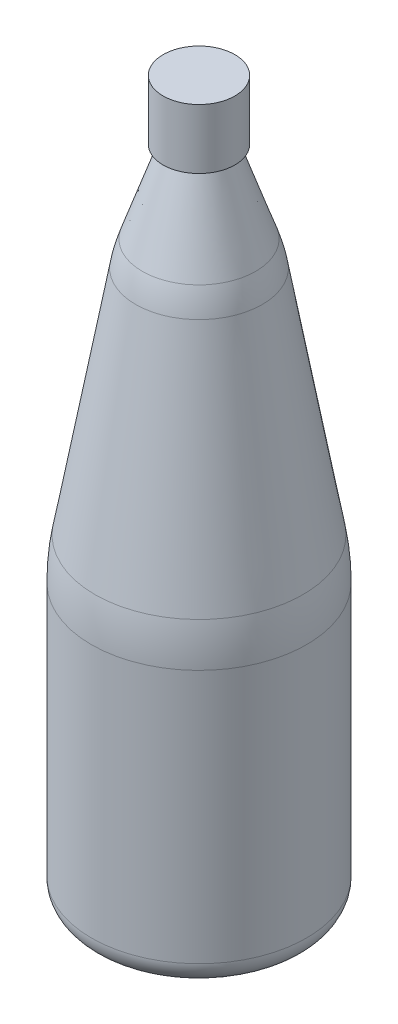
ISO-10303-21;
HEADER;
FILE_DESCRIPTION(('STEP AP214'),'2;1');
FILE_NAME('part.step','',(''),(''),'','','');
FILE_SCHEMA(('AUTOMOTIVE_DESIGN { 1 0 10303 214 1 1 1 1 }'));
ENDSEC;
DATA;
#1=APPLICATION_CONTEXT('core data for automotive mechanical design processes');
#2=APPLICATION_PROTOCOL_DEFINITION('international standard','automotive_design',2000,#1);
#3=PRODUCT_CONTEXT('',#1,'mechanical');
#4=PRODUCT('Part','Part','',(#3));
#5=PRODUCT_RELATED_PRODUCT_CATEGORY('part','',(#4));
#6=PRODUCT_DEFINITION_FORMATION('','',#4);
#7=PRODUCT_DEFINITION_CONTEXT('part definition',#1,'design');
#8=PRODUCT_DEFINITION('design','',#6,#7);
#9=PRODUCT_DEFINITION_SHAPE('','',#8);
#10=(LENGTH_UNIT() NAMED_UNIT(*) SI_UNIT(.MILLI.,.METRE.));
#11=(NAMED_UNIT(*) PLANE_ANGLE_UNIT() SI_UNIT($,.RADIAN.));
#12=(NAMED_UNIT(*) SI_UNIT($,.STERADIAN.) SOLID_ANGLE_UNIT());
#13=UNCERTAINTY_MEASURE_WITH_UNIT(LENGTH_MEASURE(1.E-05),#10,'distance_accuracy_value','');
#14=(GEOMETRIC_REPRESENTATION_CONTEXT(3) GLOBAL_UNCERTAINTY_ASSIGNED_CONTEXT((#13)) GLOBAL_UNIT_ASSIGNED_CONTEXT((#10,
#11,#12)) REPRESENTATION_CONTEXT('',''));
#15=CARTESIAN_POINT('',(0.,0.,0.));
#16=DIRECTION('',(0.,0.,1.));
#17=DIRECTION('',(1.,0.,0.));
#18=AXIS2_PLACEMENT_3D('',#15,#16,#17);
#19=CARTESIAN_POINT('',(0.,275.,0.));
#20=DIRECTION('',(0.,-1.,0.));
#21=DIRECTION('',(0.,0.,-1.));
#22=AXIS2_PLACEMENT_3D('',#19,#20,#21);
#23=CYLINDRICAL_SURFACE('',#22,45.);
#24=CARTESIAN_POINT('',(0.,116.251133647405,0.));
#25=DIRECTION('',(0.,1.,0.));
#26=DIRECTION('',(0.,0.,1.));
#27=AXIS2_PLACEMENT_3D('',#24,#25,#26);
#28=CIRCLE('',#27,45.);
#29=CARTESIAN_POINT('',(0.,116.251133647405,45.));
#30=VERTEX_POINT('',#29);
#31=EDGE_CURVE('E57',#30,#30,#28,.F.);
#32=ORIENTED_EDGE('',*,*,#31,.T.);
#33=EDGE_LOOP('',(#32));
#34=FACE_BOUND('',#33,.T.);
#35=CARTESIAN_POINT('',(0.,10.,0.));
#36=DIRECTION('',(0.,1.,0.));
#37=DIRECTION('',(0.,0.,1.));
#38=AXIS2_PLACEMENT_3D('',#35,#36,#37);
#39=CIRCLE('',#38,45.);
#40=CARTESIAN_POINT('',(0.,10.,45.));
#41=VERTEX_POINT('',#40);
#42=EDGE_CURVE('E63',#41,#41,#39,.T.);
#43=ORIENTED_EDGE('',*,*,#42,.T.);
#44=EDGE_LOOP('',(#43));
#45=FACE_BOUND('',#44,.T.);
#46=ADVANCED_FACE('F37',(#34,#45),#23,.T.);
#47=CARTESIAN_POINT('',(0.,0.,0.));
#48=DIRECTION('',(0.,1.,0.));
#49=DIRECTION('',(0.,0.,1.));
#50=AXIS2_PLACEMENT_3D('',#47,#48,#49);
#51=PLANE('',#50);
#52=CARTESIAN_POINT('',(0.,0.,0.));
#53=DIRECTION('',(0.,1.,0.));
#54=DIRECTION('',(0.,0.,1.));
#55=AXIS2_PLACEMENT_3D('',#52,#53,#54);
#56=CIRCLE('',#55,35.);
#57=CARTESIAN_POINT('',(0.,0.,35.));
#58=VERTEX_POINT('',#57);
#59=EDGE_CURVE('E60',#58,#58,#56,.F.);
#60=ORIENTED_EDGE('',*,*,#59,.T.);
#61=EDGE_LOOP('',(#60));
#62=FACE_BOUND('',#61,.T.);
#63=ADVANCED_FACE('F90',(#62),#51,.F.);
#64=CARTESIAN_POINT('',(0.,10.,0.));
#65=DIRECTION('',(0.,1.,0.));
#66=DIRECTION('',(0.,0.,1.));
#67=AXIS2_PLACEMENT_3D('',#64,#65,#66);
#68=TOROIDAL_SURFACE('',#67,35.,10.);
#69=ORIENTED_EDGE('',*,*,#59,.F.);
#70=EDGE_LOOP('',(#69));
#71=FACE_BOUND('',#70,.T.);
#72=ORIENTED_EDGE('',*,*,#42,.F.);
#73=EDGE_LOOP('',(#72));
#74=FACE_BOUND('',#73,.T.);
#75=ADVANCED_FACE('F96',(#71,#74),#68,.T.);
#76=CARTESIAN_POINT('',(0.,275.,0.));
#77=DIRECTION('',(0.,-1.,0.));
#78=DIRECTION('',(0.,0.,-1.));
#79=AXIS2_PLACEMENT_3D('',#76,#77,#78);
#80=CONICAL_SURFACE('',#79,18.5509528937302,0.17453292519943);
#81=CARTESIAN_POINT('',(0.,230.182266305579,0.));
#82=DIRECTION('',(0.,1.,0.));
#83=DIRECTION('',(0.,0.,1.));
#84=AXIS2_PLACEMENT_3D('',#81,#82,#83);
#85=CIRCLE('',#84,26.4535285582634);
#86=CARTESIAN_POINT('',(0.,230.182266305579,26.4535285582634));
#87=VERTEX_POINT('',#86);
#88=EDGE_CURVE('E44',#87,#87,#85,.F.);
#89=ORIENTED_EDGE('',*,*,#88,.T.);
#90=EDGE_LOOP('',(#89));
#91=FACE_BOUND('',#90,.T.);
#92=CARTESIAN_POINT('',(0.,133.615951414097,0.));
#93=DIRECTION('',(0.,-1.,0.));
#94=DIRECTION('',(0.,0.,-1.));
#95=AXIS2_PLACEMENT_3D('',#92,#93,#94);
#96=CIRCLE('',#95,43.4807753012209);
#97=CARTESIAN_POINT('',(0.,133.615951414097,-43.4807753012209));
#98=VERTEX_POINT('',#97);
#99=EDGE_CURVE('E52',#98,#98,#96,.F.);
#100=ORIENTED_EDGE('',*,*,#99,.T.);
#101=EDGE_LOOP('',(#100));
#102=FACE_BOUND('',#101,.T.);
#103=ADVANCED_FACE('F103',(#91,#102),#80,.T.);
#104=CARTESIAN_POINT('',(0.,116.251133647405,0.));
#105=DIRECTION('',(0.,1.,0.));
#106=DIRECTION('',(0.,0.,1.));
#107=AXIS2_PLACEMENT_3D('',#104,#105,#106);
#108=DEGENERATE_TOROIDAL_SURFACE('',#107,55.,100.,.F.);
#109=ORIENTED_EDGE('',*,*,#99,.F.);
#110=EDGE_LOOP('',(#109));
#111=FACE_BOUND('',#110,.T.);
#112=ORIENTED_EDGE('',*,*,#31,.F.);
#113=EDGE_LOOP('',(#112));
#114=FACE_BOUND('',#113,.T.);
#115=ADVANCED_FACE('F111',(#111,#114),#108,.F.);
#116=CARTESIAN_POINT('',(0.,275.,0.));
#117=DIRECTION('',(0.,-1.,0.));
#118=DIRECTION('',(0.,0.,-1.));
#119=AXIS2_PLACEMENT_3D('',#116,#117,#118);
#120=CONICAL_SURFACE('',#119,11.9330198746534,0.331612557878916);
#121=CARTESIAN_POINT('',(0.,240.816664680894,0.));
#122=DIRECTION('',(0.,1.,0.));
#123=DIRECTION('',(0.,0.,1.));
#124=AXIS2_PLACEMENT_3D('',#121,#122,#123);
#125=CIRCLE('',#124,23.7032861393611);
#126=CARTESIAN_POINT('',(0.,240.816664680894,23.7032861393611));
#127=VERTEX_POINT('',#126);
#128=EDGE_CURVE('E10',#127,#127,#125,.T.);
#129=ORIENTED_EDGE('',*,*,#128,.T.);
#130=EDGE_LOOP('',(#129));
#131=FACE_BOUND('',#130,.T.);
#132=CARTESIAN_POINT('',(0.,275.,0.));
#133=DIRECTION('',(0.,1.,0.));
#134=DIRECTION('',(0.,0.,1.));
#135=AXIS2_PLACEMENT_3D('',#132,#133,#134);
#136=CIRCLE('',#135,11.9330198746534);
#137=CARTESIAN_POINT('',(0.,275.,11.9330198746534));
#138=VERTEX_POINT('',#137);
#139=EDGE_CURVE('E48',#138,#138,#136,.T.);
#140=ORIENTED_EDGE('',*,*,#139,.F.);
#141=EDGE_LOOP('',(#140));
#142=FACE_BOUND('',#141,.T.);
#143=ADVANCED_FACE('F113',(#131,#142),#120,.T.);
#144=CARTESIAN_POINT('',(0.,218.026893868894,0.));
#145=DIRECTION('',(0.,1.,0.));
#146=DIRECTION('',(0.,0.,1.));
#147=AXIS2_PLACEMENT_3D('',#144,#145,#146);
#148=DEGENERATE_TOROIDAL_SURFACE('',#147,42.4830141525912,70.,.F.);
#149=ORIENTED_EDGE('',*,*,#128,.F.);
#150=EDGE_LOOP('',(#149));
#151=FACE_BOUND('',#150,.T.);
#152=ORIENTED_EDGE('',*,*,#88,.F.);
#153=EDGE_LOOP('',(#152));
#154=FACE_BOUND('',#153,.T.);
#155=ADVANCED_FACE('F39',(#151,#154),#148,.F.);
#156=CARTESIAN_POINT('',(0.,300.,0.));
#157=DIRECTION('',(0.,-1.,0.));
#158=DIRECTION('',(0.,0.,-1.));
#159=AXIS2_PLACEMENT_3D('',#156,#157,#158);
#160=CYLINDRICAL_SURFACE('',#159,15.);
#161=CARTESIAN_POINT('',(0.,300.,0.));
#162=DIRECTION('',(0.,1.,0.));
#163=DIRECTION('',(0.,0.,1.));
#164=AXIS2_PLACEMENT_3D('',#161,#162,#163);
#165=CIRCLE('',#164,15.);
#166=CARTESIAN_POINT('',(0.,300.,15.));
#167=VERTEX_POINT('',#166);
#168=EDGE_CURVE('E66',#167,#167,#165,.T.);
#169=ORIENTED_EDGE('',*,*,#168,.F.);
#170=EDGE_LOOP('',(#169));
#171=FACE_BOUND('',#170,.T.);
#172=CARTESIAN_POINT('',(0.,275.,0.));
#173=DIRECTION('',(0.,1.,0.));
#174=DIRECTION('',(0.,0.,1.));
#175=AXIS2_PLACEMENT_3D('',#172,#173,#174);
#176=CIRCLE('',#175,15.);
#177=CARTESIAN_POINT('',(0.,275.,15.));
#178=VERTEX_POINT('',#177);
#179=EDGE_CURVE('E67',#178,#178,#176,.T.);
#180=ORIENTED_EDGE('',*,*,#179,.T.);
#181=EDGE_LOOP('',(#180));
#182=FACE_BOUND('',#181,.T.);
#183=ADVANCED_FACE('F75',(#171,#182),#160,.T.);
#184=CARTESIAN_POINT('',(0.,300.,0.));
#185=DIRECTION('',(0.,1.,0.));
#186=DIRECTION('',(0.,0.,1.));
#187=AXIS2_PLACEMENT_3D('',#184,#185,#186);
#188=PLANE('',#187);
#189=ORIENTED_EDGE('',*,*,#168,.T.);
#190=EDGE_LOOP('',(#189));
#191=FACE_BOUND('',#190,.T.);
#192=ADVANCED_FACE('F73',(#191),#188,.T.);
#193=CARTESIAN_POINT('',(0.,275.,0.));
#194=DIRECTION('',(0.,1.,0.));
#195=DIRECTION('',(0.,0.,1.));
#196=AXIS2_PLACEMENT_3D('',#193,#194,#195);
#197=PLANE('',#196);
#198=ORIENTED_EDGE('',*,*,#139,.T.);
#199=EDGE_LOOP('',(#198));
#200=FACE_BOUND('',#199,.T.);
#201=ORIENTED_EDGE('',*,*,#179,.F.);
#202=EDGE_LOOP('',(#201));
#203=FACE_BOUND('',#202,.T.);
#204=ADVANCED_FACE('F81',(#200,#203),#197,.F.);
#205=CLOSED_SHELL('',(#46,#63,#75,#103,#115,#143,#155,#183,#192,#204));
#206=MANIFOLD_SOLID_BREP('B2',#205);
#207=ADVANCED_BREP_SHAPE_REPRESENTATION('',(#18,#206),#14);
#208=SHAPE_DEFINITION_REPRESENTATION(#9,#207);
ENDSEC;
END-ISO-10303-21;
